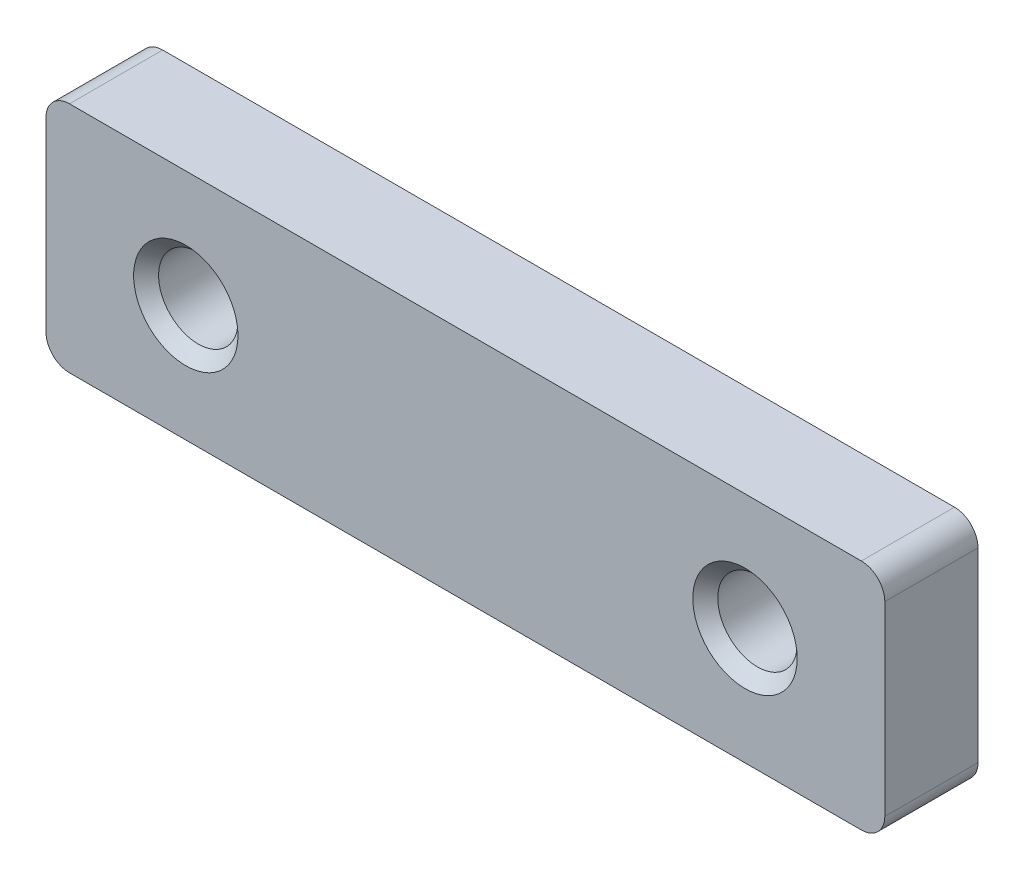
ISO-10303-21;
HEADER;
FILE_DESCRIPTION(('STEP AP214'),'2;1');
FILE_NAME('part.step','',(''),(''),'','','');
FILE_SCHEMA(('AUTOMOTIVE_DESIGN { 1 0 10303 214 1 1 1 1 }'));
ENDSEC;
DATA;
#1=APPLICATION_CONTEXT('core data for automotive mechanical design processes');
#2=APPLICATION_PROTOCOL_DEFINITION('international standard','automotive_design',2000,#1);
#3=PRODUCT_CONTEXT('',#1,'mechanical');
#4=PRODUCT('Part','Part','',(#3));
#5=PRODUCT_RELATED_PRODUCT_CATEGORY('part','',(#4));
#6=PRODUCT_DEFINITION_FORMATION('','',#4);
#7=PRODUCT_DEFINITION_CONTEXT('part definition',#1,'design');
#8=PRODUCT_DEFINITION('design','',#6,#7);
#9=PRODUCT_DEFINITION_SHAPE('','',#8);
#10=(LENGTH_UNIT() NAMED_UNIT(*) SI_UNIT(.MILLI.,.METRE.));
#11=(NAMED_UNIT(*) PLANE_ANGLE_UNIT() SI_UNIT($,.RADIAN.));
#12=(NAMED_UNIT(*) SI_UNIT($,.STERADIAN.) SOLID_ANGLE_UNIT());
#13=UNCERTAINTY_MEASURE_WITH_UNIT(LENGTH_MEASURE(1.E-05),#10,'distance_accuracy_value','');
#14=(GEOMETRIC_REPRESENTATION_CONTEXT(3) GLOBAL_UNCERTAINTY_ASSIGNED_CONTEXT((#13)) GLOBAL_UNIT_ASSIGNED_CONTEXT((#10,
#11,#12)) REPRESENTATION_CONTEXT('',''));
#15=CARTESIAN_POINT('',(0.,0.,0.));
#16=DIRECTION('',(0.,0.,1.));
#17=DIRECTION('',(1.,0.,0.));
#18=AXIS2_PLACEMENT_3D('',#15,#16,#17);
#19=CARTESIAN_POINT('',(-28.575,7.9375,-6.35));
#20=DIRECTION('',(-1.,0.,0.));
#21=DIRECTION('',(0.,0.,1.));
#22=AXIS2_PLACEMENT_3D('',#19,#20,#21);
#23=PLANE('',#22);
#24=DIRECTION('',(0.,-1.,0.));
#25=VECTOR('',#24,1.);
#26=CARTESIAN_POINT('',(-28.575,7.9375,0.));
#27=LINE('',#26,#25);
#28=CARTESIAN_POINT('',(-28.575,6.3373,0.));
#29=VERTEX_POINT('',#28);
#30=CARTESIAN_POINT('',(-28.575,-6.3373,0.));
#31=VERTEX_POINT('',#30);
#32=EDGE_CURVE('E156',#29,#31,#27,.T.);
#33=ORIENTED_EDGE('',*,*,#32,.F.);
#34=DIRECTION('',(0.,0.,1.));
#35=VECTOR('',#34,1.);
#36=CARTESIAN_POINT('',(-28.575,6.3373,-6.35));
#37=LINE('',#36,#35);
#38=CARTESIAN_POINT('',(-28.575,6.3373,-6.35));
#39=VERTEX_POINT('',#38);
#40=EDGE_CURVE('E11',#29,#39,#37,.F.);
#41=ORIENTED_EDGE('',*,*,#40,.T.);
#42=DIRECTION('',(0.,-1.,0.));
#43=VECTOR('',#42,1.);
#44=CARTESIAN_POINT('',(-28.575,7.9375,-6.35));
#45=LINE('',#44,#43);
#46=CARTESIAN_POINT('',(-28.575,-6.3373,-6.35));
#47=VERTEX_POINT('',#46);
#48=EDGE_CURVE('E159',#39,#47,#45,.T.);
#49=ORIENTED_EDGE('',*,*,#48,.T.);
#50=DIRECTION('',(0.,0.,1.));
#51=VECTOR('',#50,1.);
#52=CARTESIAN_POINT('',(-28.575,-6.3373,-6.35));
#53=LINE('',#52,#51);
#54=EDGE_CURVE('E44',#47,#31,#53,.T.);
#55=ORIENTED_EDGE('',*,*,#54,.T.);
#56=EDGE_LOOP('',(#33,#41,#49,#55));
#57=FACE_BOUND('',#56,.T.);
#58=ADVANCED_FACE('F36',(#57),#23,.T.);
#59=CARTESIAN_POINT('',(-28.575,7.9375,-6.35));
#60=DIRECTION('',(0.,1.,0.));
#61=DIRECTION('',(0.,0.,1.));
#62=AXIS2_PLACEMENT_3D('',#59,#60,#61);
#63=PLANE('',#62);
#64=DIRECTION('',(-1.,0.,0.));
#65=VECTOR('',#64,1.);
#66=CARTESIAN_POINT('',(-28.575,7.9375,0.));
#67=LINE('',#66,#65);
#68=CARTESIAN_POINT('',(26.9748,7.9375,0.));
#69=VERTEX_POINT('',#68);
#70=CARTESIAN_POINT('',(-26.9748,7.9375,0.));
#71=VERTEX_POINT('',#70);
#72=EDGE_CURVE('E121',#69,#71,#67,.T.);
#73=ORIENTED_EDGE('',*,*,#72,.F.);
#74=DIRECTION('',(0.,0.,1.));
#75=VECTOR('',#74,1.);
#76=CARTESIAN_POINT('',(26.9748,7.9375,-6.35));
#77=LINE('',#76,#75);
#78=CARTESIAN_POINT('',(26.9748,7.9375,-6.35));
#79=VERTEX_POINT('',#78);
#80=EDGE_CURVE('E139',#69,#79,#77,.F.);
#81=ORIENTED_EDGE('',*,*,#80,.T.);
#82=DIRECTION('',(-1.,0.,0.));
#83=VECTOR('',#82,1.);
#84=CARTESIAN_POINT('',(-28.575,7.9375,-6.35));
#85=LINE('',#84,#83);
#86=CARTESIAN_POINT('',(-26.9748,7.9375,-6.35));
#87=VERTEX_POINT('',#86);
#88=EDGE_CURVE('E124',#79,#87,#85,.T.);
#89=ORIENTED_EDGE('',*,*,#88,.T.);
#90=DIRECTION('',(0.,0.,1.));
#91=VECTOR('',#90,1.);
#92=CARTESIAN_POINT('',(-26.9748,7.9375,-6.35));
#93=LINE('',#92,#91);
#94=EDGE_CURVE('E136',#87,#71,#93,.T.);
#95=ORIENTED_EDGE('',*,*,#94,.T.);
#96=EDGE_LOOP('',(#73,#81,#89,#95));
#97=FACE_BOUND('',#96,.T.);
#98=ADVANCED_FACE('F235',(#97),#63,.T.);
#99=CARTESIAN_POINT('',(28.575,7.9375,-6.35));
#100=DIRECTION('',(1.,0.,0.));
#101=DIRECTION('',(0.,0.,-1.));
#102=AXIS2_PLACEMENT_3D('',#99,#100,#101);
#103=PLANE('',#102);
#104=DIRECTION('',(0.,1.,0.));
#105=VECTOR('',#104,1.);
#106=CARTESIAN_POINT('',(28.575,7.9375,-6.35));
#107=LINE('',#106,#105);
#108=CARTESIAN_POINT('',(28.575,-6.3373,-6.35));
#109=VERTEX_POINT('',#108);
#110=CARTESIAN_POINT('',(28.575,6.3373,-6.35));
#111=VERTEX_POINT('',#110);
#112=EDGE_CURVE('E129',#109,#111,#107,.T.);
#113=ORIENTED_EDGE('',*,*,#112,.T.);
#114=DIRECTION('',(0.,0.,1.));
#115=VECTOR('',#114,1.);
#116=CARTESIAN_POINT('',(28.575,6.3373,-6.35));
#117=LINE('',#116,#115);
#118=CARTESIAN_POINT('',(28.575,6.3373,0.));
#119=VERTEX_POINT('',#118);
#120=EDGE_CURVE('E120',#111,#119,#117,.T.);
#121=ORIENTED_EDGE('',*,*,#120,.T.);
#122=DIRECTION('',(0.,1.,0.));
#123=VECTOR('',#122,1.);
#124=CARTESIAN_POINT('',(28.575,7.9375,0.));
#125=LINE('',#124,#123);
#126=CARTESIAN_POINT('',(28.575,-6.3373,0.));
#127=VERTEX_POINT('',#126);
#128=EDGE_CURVE('E105',#127,#119,#125,.T.);
#129=ORIENTED_EDGE('',*,*,#128,.F.);
#130=DIRECTION('',(0.,0.,1.));
#131=VECTOR('',#130,1.);
#132=CARTESIAN_POINT('',(28.575,-6.3373,-6.35));
#133=LINE('',#132,#131);
#134=EDGE_CURVE('E118',#127,#109,#133,.F.);
#135=ORIENTED_EDGE('',*,*,#134,.T.);
#136=EDGE_LOOP('',(#113,#121,#129,#135));
#137=FACE_BOUND('',#136,.T.);
#138=ADVANCED_FACE('F117',(#137),#103,.T.);
#139=CARTESIAN_POINT('',(-28.575,-7.9375,-6.35));
#140=DIRECTION('',(0.,-1.,0.));
#141=DIRECTION('',(0.,0.,-1.));
#142=AXIS2_PLACEMENT_3D('',#139,#140,#141);
#143=PLANE('',#142);
#144=DIRECTION('',(1.,0.,0.));
#145=VECTOR('',#144,1.);
#146=CARTESIAN_POINT('',(-28.575,-7.9375,-6.35));
#147=LINE('',#146,#145);
#148=CARTESIAN_POINT('',(-26.9748,-7.9375,-6.35));
#149=VERTEX_POINT('',#148);
#150=CARTESIAN_POINT('',(26.9748,-7.9375,-6.35));
#151=VERTEX_POINT('',#150);
#152=EDGE_CURVE('E171',#149,#151,#147,.T.);
#153=ORIENTED_EDGE('',*,*,#152,.T.);
#154=DIRECTION('',(0.,0.,1.));
#155=VECTOR('',#154,1.);
#156=CARTESIAN_POINT('',(26.9748,-7.9375,-6.35));
#157=LINE('',#156,#155);
#158=CARTESIAN_POINT('',(26.9748,-7.9375,0.));
#159=VERTEX_POINT('',#158);
#160=EDGE_CURVE('E149',#151,#159,#157,.T.);
#161=ORIENTED_EDGE('',*,*,#160,.T.);
#162=DIRECTION('',(1.,0.,0.));
#163=VECTOR('',#162,1.);
#164=CARTESIAN_POINT('',(-28.575,-7.9375,0.));
#165=LINE('',#164,#163);
#166=CARTESIAN_POINT('',(-26.9748,-7.9375,0.));
#167=VERTEX_POINT('',#166);
#168=EDGE_CURVE('E106',#167,#159,#165,.T.);
#169=ORIENTED_EDGE('',*,*,#168,.F.);
#170=DIRECTION('',(0.,0.,1.));
#171=VECTOR('',#170,1.);
#172=CARTESIAN_POINT('',(-26.9748,-7.9375,-6.35));
#173=LINE('',#172,#171);
#174=EDGE_CURVE('E58',#167,#149,#173,.F.);
#175=ORIENTED_EDGE('',*,*,#174,.T.);
#176=EDGE_LOOP('',(#153,#161,#169,#175));
#177=FACE_BOUND('',#176,.T.);
#178=ADVANCED_FACE('F244',(#177),#143,.T.);
#179=CARTESIAN_POINT('',(-28.575,-7.9375,-6.35));
#180=DIRECTION('',(0.,0.,1.));
#181=DIRECTION('',(1.,0.,0.));
#182=AXIS2_PLACEMENT_3D('',#179,#180,#181);
#183=PLANE('',#182);
#184=CARTESIAN_POINT('',(19.05,0.,-6.35));
#185=DIRECTION('',(0.,0.,1.));
#186=DIRECTION('',(1.,0.,0.));
#187=AXIS2_PLACEMENT_3D('',#184,#185,#186);
#188=CIRCLE('',#187,3.556);
#189=CARTESIAN_POINT('',(22.606,0.,-6.35));
#190=VERTEX_POINT('',#189);
#191=EDGE_CURVE('E191',#190,#190,#188,.T.);
#192=ORIENTED_EDGE('',*,*,#191,.T.);
#193=EDGE_LOOP('',(#192));
#194=FACE_BOUND('',#193,.T.);
#195=CARTESIAN_POINT('',(-19.05,0.,-6.35));
#196=DIRECTION('',(0.,0.,1.));
#197=DIRECTION('',(1.,0.,0.));
#198=AXIS2_PLACEMENT_3D('',#195,#196,#197);
#199=CIRCLE('',#198,3.556);
#200=CARTESIAN_POINT('',(-15.494,0.,-6.35));
#201=VERTEX_POINT('',#200);
#202=EDGE_CURVE('E179',#201,#201,#199,.T.);
#203=ORIENTED_EDGE('',*,*,#202,.T.);
#204=EDGE_LOOP('',(#203));
#205=FACE_BOUND('',#204,.T.);
#206=ORIENTED_EDGE('',*,*,#88,.F.);
#207=CARTESIAN_POINT('',(26.9748,6.3373,-6.35));
#208=DIRECTION('',(0.,0.,1.));
#209=DIRECTION('',(1.,0.,0.));
#210=AXIS2_PLACEMENT_3D('',#207,#208,#209);
#211=CIRCLE('',#210,1.6002);
#212=EDGE_CURVE('E146',#79,#111,#211,.F.);
#213=ORIENTED_EDGE('',*,*,#212,.T.);
#214=ORIENTED_EDGE('',*,*,#112,.F.);
#215=CARTESIAN_POINT('',(26.9748,-6.3373,-6.35));
#216=DIRECTION('',(0.,0.,1.));
#217=DIRECTION('',(1.,0.,0.));
#218=AXIS2_PLACEMENT_3D('',#215,#216,#217);
#219=CIRCLE('',#218,1.6002);
#220=EDGE_CURVE('E51',#109,#151,#219,.F.);
#221=ORIENTED_EDGE('',*,*,#220,.T.);
#222=ORIENTED_EDGE('',*,*,#152,.F.);
#223=CARTESIAN_POINT('',(-26.9748,-6.3373,-6.35));
#224=DIRECTION('',(0.,0.,1.));
#225=DIRECTION('',(1.,0.,0.));
#226=AXIS2_PLACEMENT_3D('',#223,#224,#225);
#227=CIRCLE('',#226,1.6002);
#228=EDGE_CURVE('E141',#149,#47,#227,.F.);
#229=ORIENTED_EDGE('',*,*,#228,.T.);
#230=ORIENTED_EDGE('',*,*,#48,.F.);
#231=CARTESIAN_POINT('',(-26.9748,6.3373,-6.35));
#232=DIRECTION('',(0.,0.,1.));
#233=DIRECTION('',(1.,0.,0.));
#234=AXIS2_PLACEMENT_3D('',#231,#232,#233);
#235=CIRCLE('',#234,1.6002);
#236=EDGE_CURVE('E143',#39,#87,#235,.F.);
#237=ORIENTED_EDGE('',*,*,#236,.T.);
#238=EDGE_LOOP('',(#206,#213,#214,#221,#222,#229,#230,#237));
#239=FACE_BOUND('',#238,.T.);
#240=ADVANCED_FACE('F195',(#194,#205,#239),#183,.F.);
#241=CARTESIAN_POINT('',(-28.575,-7.9375,0.));
#242=DIRECTION('',(0.,0.,1.));
#243=DIRECTION('',(1.,0.,0.));
#244=AXIS2_PLACEMENT_3D('',#241,#242,#243);
#245=PLANE('',#244);
#246=CARTESIAN_POINT('',(19.05,0.,0.));
#247=DIRECTION('',(0.,0.,1.));
#248=DIRECTION('',(1.,0.,0.));
#249=AXIS2_PLACEMENT_3D('',#246,#247,#248);
#250=CIRCLE('',#249,3.556);
#251=CARTESIAN_POINT('',(22.606,0.,0.));
#252=VERTEX_POINT('',#251);
#253=EDGE_CURVE('E188',#252,#252,#250,.T.);
#254=ORIENTED_EDGE('',*,*,#253,.F.);
#255=EDGE_LOOP('',(#254));
#256=FACE_BOUND('',#255,.T.);
#257=CARTESIAN_POINT('',(-19.05,0.,0.));
#258=DIRECTION('',(0.,0.,1.));
#259=DIRECTION('',(1.,0.,0.));
#260=AXIS2_PLACEMENT_3D('',#257,#258,#259);
#261=CIRCLE('',#260,3.556);
#262=CARTESIAN_POINT('',(-15.494,0.,0.));
#263=VERTEX_POINT('',#262);
#264=EDGE_CURVE('E176',#263,#263,#261,.T.);
#265=ORIENTED_EDGE('',*,*,#264,.F.);
#266=EDGE_LOOP('',(#265));
#267=FACE_BOUND('',#266,.T.);
#268=ORIENTED_EDGE('',*,*,#128,.T.);
#269=CARTESIAN_POINT('',(26.9748,6.3373,0.));
#270=DIRECTION('',(0.,0.,1.));
#271=DIRECTION('',(1.,0.,0.));
#272=AXIS2_PLACEMENT_3D('',#269,#270,#271);
#273=CIRCLE('',#272,1.6002);
#274=EDGE_CURVE('E111',#119,#69,#273,.T.);
#275=ORIENTED_EDGE('',*,*,#274,.T.);
#276=ORIENTED_EDGE('',*,*,#72,.T.);
#277=CARTESIAN_POINT('',(-26.9748,6.3373,0.));
#278=DIRECTION('',(0.,0.,1.));
#279=DIRECTION('',(1.,0.,0.));
#280=AXIS2_PLACEMENT_3D('',#277,#278,#279);
#281=CIRCLE('',#280,1.6002);
#282=EDGE_CURVE('E112',#71,#29,#281,.T.);
#283=ORIENTED_EDGE('',*,*,#282,.T.);
#284=ORIENTED_EDGE('',*,*,#32,.T.);
#285=CARTESIAN_POINT('',(-26.9748,-6.3373,0.));
#286=DIRECTION('',(0.,0.,1.));
#287=DIRECTION('',(1.,0.,0.));
#288=AXIS2_PLACEMENT_3D('',#285,#286,#287);
#289=CIRCLE('',#288,1.6002);
#290=EDGE_CURVE('E126',#31,#167,#289,.T.);
#291=ORIENTED_EDGE('',*,*,#290,.T.);
#292=ORIENTED_EDGE('',*,*,#168,.T.);
#293=CARTESIAN_POINT('',(26.9748,-6.3373,0.));
#294=DIRECTION('',(0.,0.,1.));
#295=DIRECTION('',(1.,0.,0.));
#296=AXIS2_PLACEMENT_3D('',#293,#294,#295);
#297=CIRCLE('',#296,1.6002);
#298=EDGE_CURVE('E102',#159,#127,#297,.T.);
#299=ORIENTED_EDGE('',*,*,#298,.T.);
#300=EDGE_LOOP('',(#268,#275,#276,#283,#284,#291,#292,#299));
#301=FACE_BOUND('',#300,.T.);
#302=ADVANCED_FACE('F104',(#256,#267,#301),#245,.T.);
#303=CARTESIAN_POINT('',(-19.05,0.,-5.4991));
#304=DIRECTION('',(0.,0.,-1.));
#305=DIRECTION('',(-1.,0.,0.));
#306=AXIS2_PLACEMENT_3D('',#303,#304,#305);
#307=CONICAL_SURFACE('',#306,2.7051,0.785398163397447);
#308=ORIENTED_EDGE('',*,*,#202,.F.);
#309=EDGE_LOOP('',(#308));
#310=FACE_BOUND('',#309,.T.);
#311=CARTESIAN_POINT('',(-19.05,0.,-5.4991));
#312=DIRECTION('',(0.,0.,1.));
#313=DIRECTION('',(1.,0.,0.));
#314=AXIS2_PLACEMENT_3D('',#311,#312,#313);
#315=CIRCLE('',#314,2.7051);
#316=CARTESIAN_POINT('',(-16.3449,0.,-5.4991));
#317=VERTEX_POINT('',#316);
#318=EDGE_CURVE('E163',#317,#317,#315,.T.);
#319=ORIENTED_EDGE('',*,*,#318,.T.);
#320=EDGE_LOOP('',(#319));
#321=FACE_BOUND('',#320,.T.);
#322=ADVANCED_FACE('F220',(#310,#321),#307,.F.);
#323=CARTESIAN_POINT('',(-19.05,0.,0.));
#324=DIRECTION('',(0.,0.,1.));
#325=DIRECTION('',(1.,0.,0.));
#326=AXIS2_PLACEMENT_3D('',#323,#324,#325);
#327=CYLINDRICAL_SURFACE('',#326,2.7051);
#328=ORIENTED_EDGE('',*,*,#318,.F.);
#329=EDGE_LOOP('',(#328));
#330=FACE_BOUND('',#329,.T.);
#331=CARTESIAN_POINT('',(-19.05,0.,-0.850899999999999));
#332=DIRECTION('',(0.,0.,1.));
#333=DIRECTION('',(1.,0.,0.));
#334=AXIS2_PLACEMENT_3D('',#331,#332,#333);
#335=CIRCLE('',#334,2.7051);
#336=CARTESIAN_POINT('',(-16.3449,0.,-0.850899999999999));
#337=VERTEX_POINT('',#336);
#338=EDGE_CURVE('E167',#337,#337,#335,.T.);
#339=ORIENTED_EDGE('',*,*,#338,.T.);
#340=EDGE_LOOP('',(#339));
#341=FACE_BOUND('',#340,.T.);
#342=ADVANCED_FACE('F225',(#330,#341),#327,.F.);
#343=CARTESIAN_POINT('',(-19.05,0.,0.));
#344=DIRECTION('',(0.,0.,1.));
#345=DIRECTION('',(1.,0.,0.));
#346=AXIS2_PLACEMENT_3D('',#343,#344,#345);
#347=CONICAL_SURFACE('',#346,3.556,0.78539816339745);
#348=ORIENTED_EDGE('',*,*,#338,.F.);
#349=EDGE_LOOP('',(#348));
#350=FACE_BOUND('',#349,.T.);
#351=ORIENTED_EDGE('',*,*,#264,.T.);
#352=EDGE_LOOP('',(#351));
#353=FACE_BOUND('',#352,.T.);
#354=ADVANCED_FACE('F202',(#350,#353),#347,.F.);
#355=CARTESIAN_POINT('',(19.05,0.,-5.4991));
#356=DIRECTION('',(0.,0.,-1.));
#357=DIRECTION('',(-1.,0.,0.));
#358=AXIS2_PLACEMENT_3D('',#355,#356,#357);
#359=CONICAL_SURFACE('',#358,2.7051,0.785398163397448);
#360=ORIENTED_EDGE('',*,*,#191,.F.);
#361=EDGE_LOOP('',(#360));
#362=FACE_BOUND('',#361,.T.);
#363=CARTESIAN_POINT('',(19.05,0.,-5.4991));
#364=DIRECTION('',(0.,0.,1.));
#365=DIRECTION('',(1.,0.,0.));
#366=AXIS2_PLACEMENT_3D('',#363,#364,#365);
#367=CIRCLE('',#366,2.7051);
#368=CARTESIAN_POINT('',(21.7551,0.,-5.4991));
#369=VERTEX_POINT('',#368);
#370=EDGE_CURVE('E182',#369,#369,#367,.T.);
#371=ORIENTED_EDGE('',*,*,#370,.T.);
#372=EDGE_LOOP('',(#371));
#373=FACE_BOUND('',#372,.T.);
#374=ADVANCED_FACE('F198',(#362,#373),#359,.F.);
#375=CARTESIAN_POINT('',(19.05,0.,0.));
#376=DIRECTION('',(0.,0.,1.));
#377=DIRECTION('',(1.,0.,0.));
#378=AXIS2_PLACEMENT_3D('',#375,#376,#377);
#379=CYLINDRICAL_SURFACE('',#378,2.7051);
#380=ORIENTED_EDGE('',*,*,#370,.F.);
#381=EDGE_LOOP('',(#380));
#382=FACE_BOUND('',#381,.T.);
#383=CARTESIAN_POINT('',(19.05,0.,-0.850899999999999));
#384=DIRECTION('',(0.,0.,1.));
#385=DIRECTION('',(1.,0.,0.));
#386=AXIS2_PLACEMENT_3D('',#383,#384,#385);
#387=CIRCLE('',#386,2.7051);
#388=CARTESIAN_POINT('',(21.7551,0.,-0.850899999999999));
#389=VERTEX_POINT('',#388);
#390=EDGE_CURVE('E185',#389,#389,#387,.T.);
#391=ORIENTED_EDGE('',*,*,#390,.T.);
#392=EDGE_LOOP('',(#391));
#393=FACE_BOUND('',#392,.T.);
#394=ADVANCED_FACE('F201',(#382,#393),#379,.F.);
#395=CARTESIAN_POINT('',(19.05,0.,0.));
#396=DIRECTION('',(0.,0.,1.));
#397=DIRECTION('',(1.,0.,0.));
#398=AXIS2_PLACEMENT_3D('',#395,#396,#397);
#399=CONICAL_SURFACE('',#398,3.556,0.78539816339745);
#400=ORIENTED_EDGE('',*,*,#390,.F.);
#401=EDGE_LOOP('',(#400));
#402=FACE_BOUND('',#401,.T.);
#403=ORIENTED_EDGE('',*,*,#253,.T.);
#404=EDGE_LOOP('',(#403));
#405=FACE_BOUND('',#404,.T.);
#406=ADVANCED_FACE('F208',(#402,#405),#399,.F.);
#407=CARTESIAN_POINT('',(26.9748,6.3373,-6.35));
#408=DIRECTION('',(0.,0.,1.));
#409=DIRECTION('',(1.,0.,0.));
#410=AXIS2_PLACEMENT_3D('',#407,#408,#409);
#411=CYLINDRICAL_SURFACE('',#410,1.6002);
#412=ORIENTED_EDGE('',*,*,#212,.F.);
#413=ORIENTED_EDGE('',*,*,#80,.F.);
#414=ORIENTED_EDGE('',*,*,#274,.F.);
#415=ORIENTED_EDGE('',*,*,#120,.F.);
#416=EDGE_LOOP('',(#412,#413,#414,#415));
#417=FACE_BOUND('',#416,.T.);
#418=ADVANCED_FACE('F214',(#417),#411,.T.);
#419=CARTESIAN_POINT('',(26.9748,-6.3373,-6.35));
#420=DIRECTION('',(0.,0.,1.));
#421=DIRECTION('',(1.,0.,0.));
#422=AXIS2_PLACEMENT_3D('',#419,#420,#421);
#423=CYLINDRICAL_SURFACE('',#422,1.6002);
#424=ORIENTED_EDGE('',*,*,#220,.F.);
#425=ORIENTED_EDGE('',*,*,#134,.F.);
#426=ORIENTED_EDGE('',*,*,#298,.F.);
#427=ORIENTED_EDGE('',*,*,#160,.F.);
#428=EDGE_LOOP('',(#424,#425,#426,#427));
#429=FACE_BOUND('',#428,.T.);
#430=ADVANCED_FACE('F123',(#429),#423,.T.);
#431=CARTESIAN_POINT('',(-26.9748,6.3373,-6.35));
#432=DIRECTION('',(0.,0.,1.));
#433=DIRECTION('',(1.,0.,0.));
#434=AXIS2_PLACEMENT_3D('',#431,#432,#433);
#435=CYLINDRICAL_SURFACE('',#434,1.6002);
#436=ORIENTED_EDGE('',*,*,#236,.F.);
#437=ORIENTED_EDGE('',*,*,#40,.F.);
#438=ORIENTED_EDGE('',*,*,#282,.F.);
#439=ORIENTED_EDGE('',*,*,#94,.F.);
#440=EDGE_LOOP('',(#436,#437,#438,#439));
#441=FACE_BOUND('',#440,.T.);
#442=ADVANCED_FACE('F250',(#441),#435,.T.);
#443=CARTESIAN_POINT('',(-26.9748,-6.3373,-6.35));
#444=DIRECTION('',(0.,0.,1.));
#445=DIRECTION('',(1.,0.,0.));
#446=AXIS2_PLACEMENT_3D('',#443,#444,#445);
#447=CYLINDRICAL_SURFACE('',#446,1.6002);
#448=ORIENTED_EDGE('',*,*,#228,.F.);
#449=ORIENTED_EDGE('',*,*,#174,.F.);
#450=ORIENTED_EDGE('',*,*,#290,.F.);
#451=ORIENTED_EDGE('',*,*,#54,.F.);
#452=EDGE_LOOP('',(#448,#449,#450,#451));
#453=FACE_BOUND('',#452,.T.);
#454=ADVANCED_FACE('F38',(#453),#447,.T.);
#455=CLOSED_SHELL('',(#58,#98,#138,#178,#240,#302,#322,#342,#354,#374,#394,#406,#418,#430,#442,#454));
#456=MANIFOLD_SOLID_BREP('B2',#455);
#457=ADVANCED_BREP_SHAPE_REPRESENTATION('',(#18,#456),#14);
#458=SHAPE_DEFINITION_REPRESENTATION(#9,#457);
ENDSEC;
END-ISO-10303-21;
